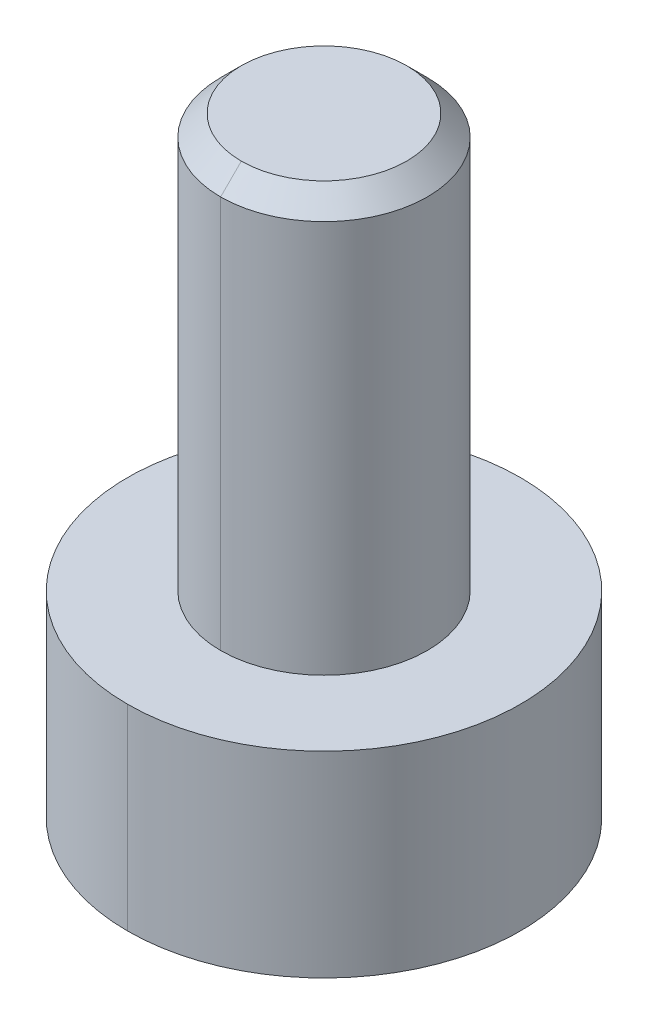
ISO-10303-21;
HEADER;
FILE_DESCRIPTION(('STEP AP214'),'2;1');
FILE_NAME('part.step','',(''),(''),'','','');
FILE_SCHEMA(('AUTOMOTIVE_DESIGN { 1 0 10303 214 1 1 1 1 }'));
ENDSEC;
DATA;
#1=APPLICATION_CONTEXT('core data for automotive mechanical design processes');
#2=APPLICATION_PROTOCOL_DEFINITION('international standard','automotive_design',2000,#1);
#3=PRODUCT_CONTEXT('',#1,'mechanical');
#4=PRODUCT('Part','Part','',(#3));
#5=PRODUCT_RELATED_PRODUCT_CATEGORY('part','',(#4));
#6=PRODUCT_DEFINITION_FORMATION('','',#4);
#7=PRODUCT_DEFINITION_CONTEXT('part definition',#1,'design');
#8=PRODUCT_DEFINITION('design','',#6,#7);
#9=PRODUCT_DEFINITION_SHAPE('','',#8);
#10=(LENGTH_UNIT() NAMED_UNIT(*) SI_UNIT(.MILLI.,.METRE.));
#11=(NAMED_UNIT(*) PLANE_ANGLE_UNIT() SI_UNIT($,.RADIAN.));
#12=(NAMED_UNIT(*) SI_UNIT($,.STERADIAN.) SOLID_ANGLE_UNIT());
#13=UNCERTAINTY_MEASURE_WITH_UNIT(LENGTH_MEASURE(1.E-05),#10,'distance_accuracy_value','');
#14=(GEOMETRIC_REPRESENTATION_CONTEXT(3) GLOBAL_UNCERTAINTY_ASSIGNED_CONTEXT((#13)) GLOBAL_UNIT_ASSIGNED_CONTEXT((#10,
#11,#12)) REPRESENTATION_CONTEXT('',''));
#15=CARTESIAN_POINT('',(0.,0.,0.));
#16=DIRECTION('',(0.,0.,1.));
#17=DIRECTION('',(1.,0.,0.));
#18=AXIS2_PLACEMENT_3D('',#15,#16,#17);
#19=CARTESIAN_POINT('',(0.,-1.,0.));
#20=DIRECTION('',(0.,-1.,0.));
#21=DIRECTION('',(0.,0.,-1.));
#22=AXIS2_PLACEMENT_3D('',#19,#20,#21);
#23=PLANE('',#22);
#24=DIRECTION('',(-0.866025403784429,0.,0.500000000000017));
#25=VECTOR('',#24,1.);
#26=CARTESIAN_POINT('',(0.75,-1.,0.4330127018922));
#27=LINE('',#26,#25);
#28=CARTESIAN_POINT('',(0.75,-1.,0.4330127018922));
#29=VERTEX_POINT('',#28);
#30=CARTESIAN_POINT('',(0.,-1.,0.866025403784408));
#31=VERTEX_POINT('',#30);
#32=EDGE_CURVE('E131',#29,#31,#27,.T.);
#33=ORIENTED_EDGE('',*,*,#32,.T.);
#34=DIRECTION('',(-0.866025403784429,0.,-0.500000000000017));
#35=VECTOR('',#34,1.);
#36=CARTESIAN_POINT('',(0.,-1.,0.8660254037844));
#37=LINE('',#36,#35);
#38=CARTESIAN_POINT('',(-0.749999999999992,-1.,0.433012701892186));
#39=VERTEX_POINT('',#38);
#40=EDGE_CURVE('E11',#31,#39,#37,.T.);
#41=ORIENTED_EDGE('',*,*,#40,.T.);
#42=DIRECTION('',(0.,0.,-1.));
#43=VECTOR('',#42,1.);
#44=CARTESIAN_POINT('',(-0.75,-1.,0.4330127018922));
#45=LINE('',#44,#43);
#46=CARTESIAN_POINT('',(-0.75,-1.,-0.4330127018922));
#47=VERTEX_POINT('',#46);
#48=EDGE_CURVE('E216',#39,#47,#45,.T.);
#49=ORIENTED_EDGE('',*,*,#48,.T.);
#50=DIRECTION('',(0.866025403784429,0.,-0.500000000000017));
#51=VECTOR('',#50,1.);
#52=CARTESIAN_POINT('',(-0.75,-1.,-0.4330127018922));
#53=LINE('',#52,#51);
#54=CARTESIAN_POINT('',(0.,-1.,-0.866025403784415));
#55=VERTEX_POINT('',#54);
#56=EDGE_CURVE('E217',#47,#55,#53,.T.);
#57=ORIENTED_EDGE('',*,*,#56,.T.);
#58=DIRECTION('',(0.866025403784429,0.,0.500000000000017));
#59=VECTOR('',#58,1.);
#60=CARTESIAN_POINT('',(0.,-1.,-0.8660254037844));
#61=LINE('',#60,#59);
#62=CARTESIAN_POINT('',(0.749999999999992,-1.,-0.433012701892186));
#63=VERTEX_POINT('',#62);
#64=EDGE_CURVE('E133',#55,#63,#61,.T.);
#65=ORIENTED_EDGE('',*,*,#64,.T.);
#66=DIRECTION('',(0.,0.,1.));
#67=VECTOR('',#66,1.);
#68=CARTESIAN_POINT('',(0.75,-1.,-0.4330127018922));
#69=LINE('',#68,#67);
#70=EDGE_CURVE('E128',#63,#29,#69,.T.);
#71=ORIENTED_EDGE('',*,*,#70,.T.);
#72=EDGE_LOOP('',(#33,#41,#49,#57,#65,#71));
#73=FACE_BOUND('',#72,.T.);
#74=ADVANCED_FACE('F16',(#73),#23,.T.);
#75=CARTESIAN_POINT('',(0.,-2.,0.8660254037844));
#76=DIRECTION('',(-0.500000000000017,0.,0.866025403784429));
#77=DIRECTION('',(0.,1.,0.));
#78=AXIS2_PLACEMENT_3D('',#75,#76,#77);
#79=PLANE('',#78);
#80=ORIENTED_EDGE('',*,*,#40,.F.);
#81=DIRECTION('',(0.,-1.,0.));
#82=VECTOR('',#81,1.);
#83=CARTESIAN_POINT('',(0.,-2.,0.866025403784429));
#84=LINE('',#83,#82);
#85=CARTESIAN_POINT('',(0.,-2.,0.866025403784407));
#86=VERTEX_POINT('',#85);
#87=EDGE_CURVE('E138',#31,#86,#84,.T.);
#88=ORIENTED_EDGE('',*,*,#87,.T.);
#89=DIRECTION('',(-0.866025403784448,0.,-0.499999999999983));
#90=VECTOR('',#89,1.);
#91=CARTESIAN_POINT('',(0.,-2.,0.8660254037844));
#92=LINE('',#91,#90);
#93=CARTESIAN_POINT('',(-0.749999999999992,-2.,0.433012701892186));
#94=VERTEX_POINT('',#93);
#95=EDGE_CURVE('E160',#86,#94,#92,.T.);
#96=ORIENTED_EDGE('',*,*,#95,.T.);
#97=DIRECTION('',(0.,1.,0.));
#98=VECTOR('',#97,1.);
#99=CARTESIAN_POINT('',(-0.75,-2.,0.4330127018922));
#100=LINE('',#99,#98);
#101=EDGE_CURVE('E27',#94,#39,#100,.T.);
#102=ORIENTED_EDGE('',*,*,#101,.T.);
#103=EDGE_LOOP('',(#80,#88,#96,#102));
#104=FACE_BOUND('',#103,.T.);
#105=ADVANCED_FACE('F307',(#104),#79,.F.);
#106=CARTESIAN_POINT('',(-0.75,-2.,0.4330127018922));
#107=DIRECTION('',(-1.,0.,0.));
#108=DIRECTION('',(0.,0.,1.));
#109=AXIS2_PLACEMENT_3D('',#106,#107,#108);
#110=PLANE('',#109);
#111=ORIENTED_EDGE('',*,*,#48,.F.);
#112=ORIENTED_EDGE('',*,*,#101,.F.);
#113=DIRECTION('',(0.,0.,-1.));
#114=VECTOR('',#113,1.);
#115=CARTESIAN_POINT('',(-0.75,-2.,0.));
#116=LINE('',#115,#114);
#117=CARTESIAN_POINT('',(-0.75,-2.,-0.4330127018922));
#118=VERTEX_POINT('',#117);
#119=EDGE_CURVE('E187',#94,#118,#116,.T.);
#120=ORIENTED_EDGE('',*,*,#119,.T.);
#121=DIRECTION('',(0.,1.,0.));
#122=VECTOR('',#121,1.);
#123=CARTESIAN_POINT('',(-0.75,-2.,-0.4330127018922));
#124=LINE('',#123,#122);
#125=EDGE_CURVE('E212',#118,#47,#124,.T.);
#126=ORIENTED_EDGE('',*,*,#125,.T.);
#127=EDGE_LOOP('',(#111,#112,#120,#126));
#128=FACE_BOUND('',#127,.T.);
#129=ADVANCED_FACE('F289',(#128),#110,.F.);
#130=CARTESIAN_POINT('',(-0.75,-2.,-0.4330127018922));
#131=DIRECTION('',(-0.500000000000017,0.,-0.866025403784429));
#132=DIRECTION('',(-0.866025403784429,0.,0.500000000000017));
#133=AXIS2_PLACEMENT_3D('',#130,#131,#132);
#134=PLANE('',#133);
#135=ORIENTED_EDGE('',*,*,#56,.F.);
#136=ORIENTED_EDGE('',*,*,#125,.F.);
#137=DIRECTION('',(0.866025403784448,0.,-0.499999999999983));
#138=VECTOR('',#137,1.);
#139=CARTESIAN_POINT('',(-0.75,-2.,-0.4330127018922));
#140=LINE('',#139,#138);
#141=CARTESIAN_POINT('',(0.,-2.,-0.866025403784415));
#142=VERTEX_POINT('',#141);
#143=EDGE_CURVE('E183',#118,#142,#140,.T.);
#144=ORIENTED_EDGE('',*,*,#143,.T.);
#145=DIRECTION('',(0.,1.,0.));
#146=VECTOR('',#145,1.);
#147=CARTESIAN_POINT('',(0.,-2.,-0.8660254037844));
#148=LINE('',#147,#146);
#149=EDGE_CURVE('E20',#142,#55,#148,.T.);
#150=ORIENTED_EDGE('',*,*,#149,.T.);
#151=EDGE_LOOP('',(#135,#136,#144,#150));
#152=FACE_BOUND('',#151,.T.);
#153=ADVANCED_FACE('F293',(#152),#134,.F.);
#154=CARTESIAN_POINT('',(0.,-2.,-0.8660254037844));
#155=DIRECTION('',(0.500000000000017,0.,-0.866025403784429));
#156=DIRECTION('',(0.,-1.,0.));
#157=AXIS2_PLACEMENT_3D('',#154,#155,#156);
#158=PLANE('',#157);
#159=ORIENTED_EDGE('',*,*,#64,.F.);
#160=ORIENTED_EDGE('',*,*,#149,.F.);
#161=DIRECTION('',(0.866025403784448,0.,0.499999999999983));
#162=VECTOR('',#161,1.);
#163=CARTESIAN_POINT('',(0.,-2.,-0.8660254037844));
#164=LINE('',#163,#162);
#165=CARTESIAN_POINT('',(0.749999999999992,-2.,-0.433012701892186));
#166=VERTEX_POINT('',#165);
#167=EDGE_CURVE('E188',#142,#166,#164,.T.);
#168=ORIENTED_EDGE('',*,*,#167,.T.);
#169=DIRECTION('',(0.,1.,0.));
#170=VECTOR('',#169,1.);
#171=CARTESIAN_POINT('',(0.75,-2.,-0.4330127018922));
#172=LINE('',#171,#170);
#173=EDGE_CURVE('E137',#166,#63,#172,.T.);
#174=ORIENTED_EDGE('',*,*,#173,.T.);
#175=EDGE_LOOP('',(#159,#160,#168,#174));
#176=FACE_BOUND('',#175,.T.);
#177=ADVANCED_FACE('F295',(#176),#158,.F.);
#178=CARTESIAN_POINT('',(0.75,-2.,-0.4330127018922));
#179=DIRECTION('',(1.,0.,0.));
#180=DIRECTION('',(0.,1.,0.));
#181=AXIS2_PLACEMENT_3D('',#178,#179,#180);
#182=PLANE('',#181);
#183=ORIENTED_EDGE('',*,*,#70,.F.);
#184=ORIENTED_EDGE('',*,*,#173,.F.);
#185=DIRECTION('',(0.,0.,1.));
#186=VECTOR('',#185,1.);
#187=CARTESIAN_POINT('',(0.75,-2.,0.));
#188=LINE('',#187,#186);
#189=CARTESIAN_POINT('',(0.75,-2.,0.4330127018922));
#190=VERTEX_POINT('',#189);
#191=EDGE_CURVE('E144',#166,#190,#188,.T.);
#192=ORIENTED_EDGE('',*,*,#191,.T.);
#193=DIRECTION('',(0.,1.,0.));
#194=VECTOR('',#193,1.);
#195=CARTESIAN_POINT('',(0.75,-2.,0.4330127018922));
#196=LINE('',#195,#194);
#197=EDGE_CURVE('E141',#190,#29,#196,.T.);
#198=ORIENTED_EDGE('',*,*,#197,.T.);
#199=EDGE_LOOP('',(#183,#184,#192,#198));
#200=FACE_BOUND('',#199,.T.);
#201=ADVANCED_FACE('F142',(#200),#182,.F.);
#202=CARTESIAN_POINT('',(0.75,-2.,0.4330127018922));
#203=DIRECTION('',(0.500000000000017,0.,0.866025403784429));
#204=DIRECTION('',(0.,-1.,0.));
#205=AXIS2_PLACEMENT_3D('',#202,#203,#204);
#206=PLANE('',#205);
#207=ORIENTED_EDGE('',*,*,#32,.F.);
#208=ORIENTED_EDGE('',*,*,#197,.F.);
#209=DIRECTION('',(-0.866025403784448,0.,0.499999999999983));
#210=VECTOR('',#209,1.);
#211=CARTESIAN_POINT('',(0.75,-2.,0.4330127018922));
#212=LINE('',#211,#210);
#213=EDGE_CURVE('E153',#190,#86,#212,.T.);
#214=ORIENTED_EDGE('',*,*,#213,.T.);
#215=ORIENTED_EDGE('',*,*,#87,.F.);
#216=EDGE_LOOP('',(#207,#208,#214,#215));
#217=FACE_BOUND('',#216,.T.);
#218=ADVANCED_FACE('F151',(#217),#206,.F.);
#219=CARTESIAN_POINT('',(0.,-2.,0.));
#220=DIRECTION('',(0.,1.,0.));
#221=DIRECTION('',(1.,0.,0.));
#222=AXIS2_PLACEMENT_3D('',#219,#220,#221);
#223=PLANE('',#222);
#224=ORIENTED_EDGE('',*,*,#191,.F.);
#225=ORIENTED_EDGE('',*,*,#167,.F.);
#226=ORIENTED_EDGE('',*,*,#143,.F.);
#227=ORIENTED_EDGE('',*,*,#119,.F.);
#228=ORIENTED_EDGE('',*,*,#95,.F.);
#229=ORIENTED_EDGE('',*,*,#213,.F.);
#230=EDGE_LOOP('',(#224,#225,#226,#227,#228,#229));
#231=FACE_BOUND('',#230,.T.);
#232=CARTESIAN_POINT('',(0.,-2.00000000000075,0.));
#233=DIRECTION('',(0.,1.,0.));
#234=DIRECTION('',(0.,0.,1.));
#235=AXIS2_PLACEMENT_3D('',#232,#233,#234);
#236=CIRCLE('',#235,1.72679491930694);
#237=CARTESIAN_POINT('',(0.,-2.00000000000075,1.72679491930694));
#238=VERTEX_POINT('',#237);
#239=CARTESIAN_POINT('',(0.,-2.00000000000075,-1.72679491930694));
#240=VERTEX_POINT('',#239);
#241=EDGE_CURVE('E198',#238,#240,#236,.T.);
#242=ORIENTED_EDGE('',*,*,#241,.F.);
#243=CARTESIAN_POINT('',(0.,-2.00000000000075,0.));
#244=DIRECTION('',(0.,1.,0.));
#245=DIRECTION('',(0.,0.,1.));
#246=AXIS2_PLACEMENT_3D('',#243,#244,#245);
#247=CIRCLE('',#246,1.72679491930694);
#248=EDGE_CURVE('E173',#240,#238,#247,.T.);
#249=ORIENTED_EDGE('',*,*,#248,.F.);
#250=EDGE_LOOP('',(#242,#249));
#251=FACE_BOUND('',#250,.T.);
#252=ADVANCED_FACE('F481',(#231,#251),#223,.F.);
#253=CARTESIAN_POINT('',(0.,-1.90000000009149,0.));
#254=DIRECTION('',(0.,1.,0.));
#255=DIRECTION('',(0.,0.,1.));
#256=AXIS2_PLACEMENT_3D('',#253,#254,#255);
#257=CONICAL_SURFACE('',#256,1.89999999992096,1.04719755123235);
#258=DIRECTION('',(0.,0.499999999969035,-0.866025403802317));
#259=VECTOR('',#258,1.);
#260=CARTESIAN_POINT('',(0.,-1.90000000009149,-1.89999999992096));
#261=LINE('',#260,#259);
#262=CARTESIAN_POINT('',(0.,-1.90000000001,-1.90000000006212));
#263=VERTEX_POINT('',#262);
#264=EDGE_CURVE('E163',#240,#263,#261,.T.);
#265=ORIENTED_EDGE('',*,*,#264,.F.);
#266=ORIENTED_EDGE('',*,*,#248,.T.);
#267=DIRECTION('',(0.,0.499999999969035,0.866025403802317));
#268=VECTOR('',#267,1.);
#269=CARTESIAN_POINT('',(0.,-1.90000000009149,1.89999999992096));
#270=LINE('',#269,#268);
#271=CARTESIAN_POINT('',(0.,-1.90000000001,1.90000000006212));
#272=VERTEX_POINT('',#271);
#273=EDGE_CURVE('E225',#238,#272,#270,.T.);
#274=ORIENTED_EDGE('',*,*,#273,.T.);
#275=CARTESIAN_POINT('',(0.,-1.90000000001,0.));
#276=DIRECTION('',(0.,1.,0.));
#277=DIRECTION('',(0.,0.,1.));
#278=AXIS2_PLACEMENT_3D('',#275,#276,#277);
#279=CIRCLE('',#278,1.9);
#280=EDGE_CURVE('E170',#263,#272,#279,.T.);
#281=ORIENTED_EDGE('',*,*,#280,.F.);
#282=EDGE_LOOP('',(#265,#266,#274,#281));
#283=FACE_BOUND('',#282,.T.);
#284=ADVANCED_FACE('F476',(#283),#257,.T.);
#285=CARTESIAN_POINT('',(0.,-2.3,0.));
#286=DIRECTION('',(0.,1.,0.));
#287=DIRECTION('',(0.,0.,1.));
#288=AXIS2_PLACEMENT_3D('',#285,#286,#287);
#289=CYLINDRICAL_SURFACE('',#288,1.9);
#290=DIRECTION('',(0.,1.,0.));
#291=VECTOR('',#290,1.);
#292=CARTESIAN_POINT('',(0.,-2.3,-1.9));
#293=LINE('',#292,#291);
#294=CARTESIAN_POINT('',(0.,0.,-1.9));
#295=VERTEX_POINT('',#294);
#296=EDGE_CURVE('E259',#263,#295,#293,.T.);
#297=ORIENTED_EDGE('',*,*,#296,.F.);
#298=ORIENTED_EDGE('',*,*,#280,.T.);
#299=DIRECTION('',(0.,1.,0.));
#300=VECTOR('',#299,1.);
#301=CARTESIAN_POINT('',(0.,-2.3,1.9));
#302=LINE('',#301,#300);
#303=CARTESIAN_POINT('',(0.,0.,1.9));
#304=VERTEX_POINT('',#303);
#305=EDGE_CURVE('E194',#272,#304,#302,.T.);
#306=ORIENTED_EDGE('',*,*,#305,.T.);
#307=CARTESIAN_POINT('',(0.,0.,0.));
#308=DIRECTION('',(0.,1.,0.));
#309=DIRECTION('',(0.,0.,1.));
#310=AXIS2_PLACEMENT_3D('',#307,#308,#309);
#311=CIRCLE('',#310,1.9);
#312=EDGE_CURVE('E174',#295,#304,#311,.T.);
#313=ORIENTED_EDGE('',*,*,#312,.F.);
#314=EDGE_LOOP('',(#297,#298,#306,#313));
#315=FACE_BOUND('',#314,.T.);
#316=ADVANCED_FACE('F480',(#315),#289,.T.);
#317=CARTESIAN_POINT('',(0.,4.,0.));
#318=DIRECTION('',(0.,1.,0.));
#319=DIRECTION('',(1.,0.,0.));
#320=AXIS2_PLACEMENT_3D('',#317,#318,#319);
#321=PLANE('',#320);
#322=CARTESIAN_POINT('',(0.,4.00000000007595,0.));
#323=DIRECTION('',(0.,-1.,0.));
#324=DIRECTION('',(0.,0.,-1.));
#325=AXIS2_PLACEMENT_3D('',#322,#323,#324);
#326=CIRCLE('',#325,0.800000000026557);
#327=CARTESIAN_POINT('',(0.,4.00000000007595,-0.800000000026557));
#328=VERTEX_POINT('',#327);
#329=CARTESIAN_POINT('',(0.,4.00000000007595,0.800000000026557));
#330=VERTEX_POINT('',#329);
#331=EDGE_CURVE('E207',#328,#330,#326,.T.);
#332=ORIENTED_EDGE('',*,*,#331,.F.);
#333=CARTESIAN_POINT('',(0.,4.00000000007595,0.));
#334=DIRECTION('',(0.,-1.,0.));
#335=DIRECTION('',(0.,0.,-1.));
#336=AXIS2_PLACEMENT_3D('',#333,#334,#335);
#337=CIRCLE('',#336,0.800000000026557);
#338=EDGE_CURVE('E200',#330,#328,#337,.T.);
#339=ORIENTED_EDGE('',*,*,#338,.F.);
#340=EDGE_LOOP('',(#332,#339));
#341=FACE_BOUND('',#340,.T.);
#342=ADVANCED_FACE('F513',(#341),#321,.T.);
#343=CARTESIAN_POINT('',(0.,0.,0.));
#344=DIRECTION('',(0.,1.,0.));
#345=DIRECTION('',(1.,0.,0.));
#346=AXIS2_PLACEMENT_3D('',#343,#344,#345);
#347=PLANE('',#346);
#348=CARTESIAN_POINT('',(0.,0.,0.));
#349=DIRECTION('',(0.,1.,0.));
#350=DIRECTION('',(0.,0.,1.));
#351=AXIS2_PLACEMENT_3D('',#348,#349,#350);
#352=CIRCLE('',#351,1.);
#353=CARTESIAN_POINT('',(0.,0.,1.));
#354=VERTEX_POINT('',#353);
#355=CARTESIAN_POINT('',(0.,0.,-1.));
#356=VERTEX_POINT('',#355);
#357=EDGE_CURVE('E179',#354,#356,#352,.T.);
#358=ORIENTED_EDGE('',*,*,#357,.F.);
#359=CARTESIAN_POINT('',(0.,0.,0.));
#360=DIRECTION('',(0.,1.,0.));
#361=DIRECTION('',(0.,0.,1.));
#362=AXIS2_PLACEMENT_3D('',#359,#360,#361);
#363=CIRCLE('',#362,1.);
#364=EDGE_CURVE('E222',#356,#354,#363,.T.);
#365=ORIENTED_EDGE('',*,*,#364,.F.);
#366=EDGE_LOOP('',(#358,#365));
#367=FACE_BOUND('',#366,.T.);
#368=CARTESIAN_POINT('',(0.,0.,0.));
#369=DIRECTION('',(0.,1.,0.));
#370=DIRECTION('',(0.,0.,1.));
#371=AXIS2_PLACEMENT_3D('',#368,#369,#370);
#372=CIRCLE('',#371,1.9);
#373=EDGE_CURVE('E199',#304,#295,#372,.T.);
#374=ORIENTED_EDGE('',*,*,#373,.T.);
#375=ORIENTED_EDGE('',*,*,#312,.T.);
#376=EDGE_LOOP('',(#374,#375));
#377=FACE_BOUND('',#376,.T.);
#378=ADVANCED_FACE('F327',(#367,#377),#347,.T.);
#379=CARTESIAN_POINT('',(0.,3.80000000001246,0.));
#380=DIRECTION('',(0.,-1.,0.));
#381=DIRECTION('',(0.,0.,-1.));
#382=AXIS2_PLACEMENT_3D('',#379,#380,#381);
#383=CONICAL_SURFACE('',#382,1.0000000000332,0.78539816325534);
#384=DIRECTION('',(0.,-0.707106781287033,0.707106781086062));
#385=VECTOR('',#384,1.);
#386=CARTESIAN_POINT('',(0.,3.80000000001246,1.0000000000332));
#387=LINE('',#386,#385);
#388=CARTESIAN_POINT('',(0.,3.80000000001,1.00000000003566));
#389=VERTEX_POINT('',#388);
#390=EDGE_CURVE('E211',#330,#389,#387,.T.);
#391=ORIENTED_EDGE('',*,*,#390,.F.);
#392=ORIENTED_EDGE('',*,*,#338,.T.);
#393=DIRECTION('',(0.,-0.707106781287033,-0.707106781086062));
#394=VECTOR('',#393,1.);
#395=CARTESIAN_POINT('',(0.,3.80000000001246,-1.0000000000332));
#396=LINE('',#395,#394);
#397=CARTESIAN_POINT('',(0.,3.80000000001,-1.00000000003566));
#398=VERTEX_POINT('',#397);
#399=EDGE_CURVE('E221',#328,#398,#396,.T.);
#400=ORIENTED_EDGE('',*,*,#399,.T.);
#401=CARTESIAN_POINT('',(0.,3.80000000001,0.));
#402=DIRECTION('',(0.,-1.,0.));
#403=DIRECTION('',(0.,0.,1.));
#404=AXIS2_PLACEMENT_3D('',#401,#402,#403);
#405=CIRCLE('',#404,1.);
#406=EDGE_CURVE('E203',#389,#398,#405,.T.);
#407=ORIENTED_EDGE('',*,*,#406,.F.);
#408=EDGE_LOOP('',(#391,#392,#400,#407));
#409=FACE_BOUND('',#408,.T.);
#410=ADVANCED_FACE('F18',(#409),#383,.T.);
#411=CARTESIAN_POINT('',(0.,-2.3,0.));
#412=DIRECTION('',(0.,1.,0.));
#413=DIRECTION('',(0.,0.,1.));
#414=AXIS2_PLACEMENT_3D('',#411,#412,#413);
#415=CYLINDRICAL_SURFACE('',#414,1.);
#416=DIRECTION('',(0.,1.,0.));
#417=VECTOR('',#416,1.);
#418=CARTESIAN_POINT('',(0.,-2.3,-1.));
#419=LINE('',#418,#417);
#420=EDGE_CURVE('E169',#356,#398,#419,.T.);
#421=ORIENTED_EDGE('',*,*,#420,.F.);
#422=ORIENTED_EDGE('',*,*,#364,.T.);
#423=DIRECTION('',(0.,1.,0.));
#424=VECTOR('',#423,1.);
#425=CARTESIAN_POINT('',(0.,-2.3,1.));
#426=LINE('',#425,#424);
#427=EDGE_CURVE('E168',#354,#389,#426,.T.);
#428=ORIENTED_EDGE('',*,*,#427,.T.);
#429=ORIENTED_EDGE('',*,*,#406,.T.);
#430=EDGE_LOOP('',(#421,#422,#428,#429));
#431=FACE_BOUND('',#430,.T.);
#432=ADVANCED_FACE('F317',(#431),#415,.T.);
#433=CARTESIAN_POINT('',(0.,-1.90000000009149,0.));
#434=DIRECTION('',(0.,1.,0.));
#435=DIRECTION('',(0.,0.,1.));
#436=AXIS2_PLACEMENT_3D('',#433,#434,#435);
#437=CONICAL_SURFACE('',#436,1.89999999992096,1.04719755123235);
#438=ORIENTED_EDGE('',*,*,#241,.T.);
#439=ORIENTED_EDGE('',*,*,#264,.T.);
#440=CARTESIAN_POINT('',(0.,-1.90000000001,0.));
#441=DIRECTION('',(0.,1.,0.));
#442=DIRECTION('',(0.,0.,1.));
#443=AXIS2_PLACEMENT_3D('',#440,#441,#442);
#444=CIRCLE('',#443,1.9);
#445=EDGE_CURVE('E229',#272,#263,#444,.T.);
#446=ORIENTED_EDGE('',*,*,#445,.F.);
#447=ORIENTED_EDGE('',*,*,#273,.F.);
#448=EDGE_LOOP('',(#438,#439,#446,#447));
#449=FACE_BOUND('',#448,.T.);
#450=ADVANCED_FACE('F319',(#449),#437,.T.);
#451=CARTESIAN_POINT('',(0.,-2.3,0.));
#452=DIRECTION('',(0.,1.,0.));
#453=DIRECTION('',(0.,0.,1.));
#454=AXIS2_PLACEMENT_3D('',#451,#452,#453);
#455=CYLINDRICAL_SURFACE('',#454,1.9);
#456=ORIENTED_EDGE('',*,*,#445,.T.);
#457=ORIENTED_EDGE('',*,*,#296,.T.);
#458=ORIENTED_EDGE('',*,*,#373,.F.);
#459=ORIENTED_EDGE('',*,*,#305,.F.);
#460=EDGE_LOOP('',(#456,#457,#458,#459));
#461=FACE_BOUND('',#460,.T.);
#462=ADVANCED_FACE('F315',(#461),#455,.T.);
#463=CARTESIAN_POINT('',(0.,3.80000000001246,0.));
#464=DIRECTION('',(0.,-1.,0.));
#465=DIRECTION('',(0.,0.,-1.));
#466=AXIS2_PLACEMENT_3D('',#463,#464,#465);
#467=CONICAL_SURFACE('',#466,1.0000000000332,0.78539816325534);
#468=ORIENTED_EDGE('',*,*,#331,.T.);
#469=ORIENTED_EDGE('',*,*,#390,.T.);
#470=CARTESIAN_POINT('',(0.,3.80000000001,0.));
#471=DIRECTION('',(0.,-1.,0.));
#472=DIRECTION('',(0.,0.,1.));
#473=AXIS2_PLACEMENT_3D('',#470,#471,#472);
#474=CIRCLE('',#473,1.);
#475=EDGE_CURVE('E165',#398,#389,#474,.T.);
#476=ORIENTED_EDGE('',*,*,#475,.F.);
#477=ORIENTED_EDGE('',*,*,#399,.F.);
#478=EDGE_LOOP('',(#468,#469,#476,#477));
#479=FACE_BOUND('',#478,.T.);
#480=ADVANCED_FACE('F466',(#479),#467,.T.);
#481=CARTESIAN_POINT('',(0.,-2.3,0.));
#482=DIRECTION('',(0.,1.,0.));
#483=DIRECTION('',(0.,0.,1.));
#484=AXIS2_PLACEMENT_3D('',#481,#482,#483);
#485=CYLINDRICAL_SURFACE('',#484,1.);
#486=ORIENTED_EDGE('',*,*,#357,.T.);
#487=ORIENTED_EDGE('',*,*,#420,.T.);
#488=ORIENTED_EDGE('',*,*,#475,.T.);
#489=ORIENTED_EDGE('',*,*,#427,.F.);
#490=EDGE_LOOP('',(#486,#487,#488,#489));
#491=FACE_BOUND('',#490,.T.);
#492=ADVANCED_FACE('F333',(#491),#485,.T.);
#493=CLOSED_SHELL('',(#74,#105,#129,#153,#177,#201,#218,#252,#284,#316,#342,#378,#410,#432,#450,
#462,#480,#492));
#494=MANIFOLD_SOLID_BREP('B1',#493);
#495=ADVANCED_BREP_SHAPE_REPRESENTATION('',(#18,#494),#14);
#496=SHAPE_DEFINITION_REPRESENTATION(#9,#495);
ENDSEC;
END-ISO-10303-21;
